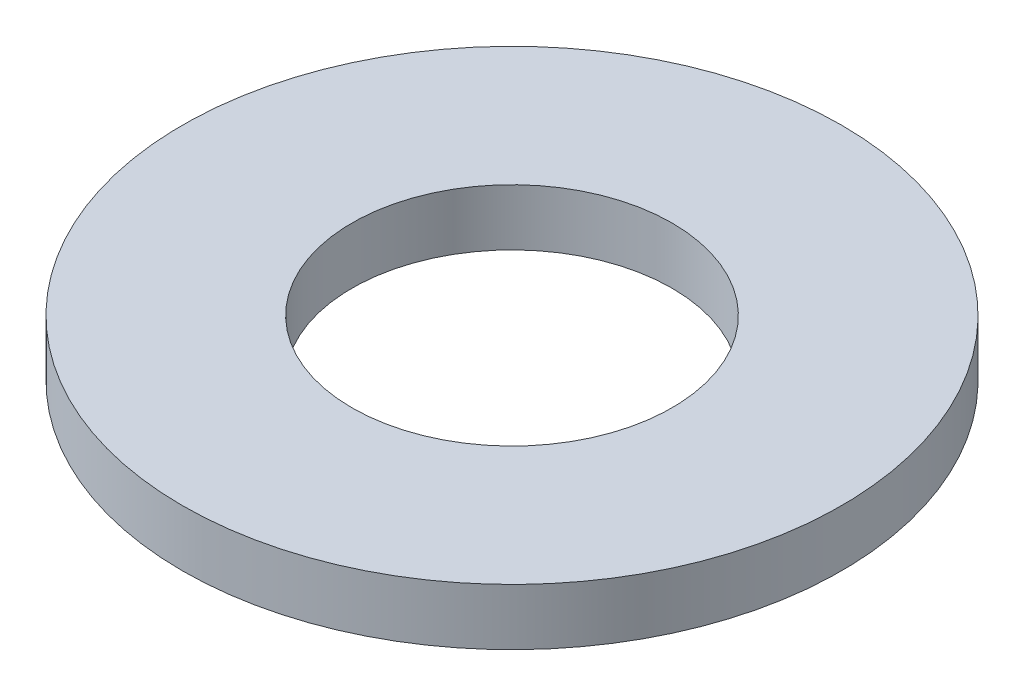
ISO-10303-21;
HEADER;
FILE_DESCRIPTION(('STEP AP214'),'2;1');
FILE_NAME('part.step','',(''),(''),'','','');
FILE_SCHEMA(('AUTOMOTIVE_DESIGN { 1 0 10303 214 1 1 1 1 }'));
ENDSEC;
DATA;
#1=APPLICATION_CONTEXT('core data for automotive mechanical design processes');
#2=APPLICATION_PROTOCOL_DEFINITION('international standard','automotive_design',2000,#1);
#3=PRODUCT_CONTEXT('',#1,'mechanical');
#4=PRODUCT('Part','Part','',(#3));
#5=PRODUCT_RELATED_PRODUCT_CATEGORY('part','',(#4));
#6=PRODUCT_DEFINITION_FORMATION('','',#4);
#7=PRODUCT_DEFINITION_CONTEXT('part definition',#1,'design');
#8=PRODUCT_DEFINITION('design','',#6,#7);
#9=PRODUCT_DEFINITION_SHAPE('','',#8);
#10=(LENGTH_UNIT() NAMED_UNIT(*) SI_UNIT(.MILLI.,.METRE.));
#11=(NAMED_UNIT(*) PLANE_ANGLE_UNIT() SI_UNIT($,.RADIAN.));
#12=(NAMED_UNIT(*) SI_UNIT($,.STERADIAN.) SOLID_ANGLE_UNIT());
#13=UNCERTAINTY_MEASURE_WITH_UNIT(LENGTH_MEASURE(1.E-05),#10,'distance_accuracy_value','');
#14=(GEOMETRIC_REPRESENTATION_CONTEXT(3) GLOBAL_UNCERTAINTY_ASSIGNED_CONTEXT((#13)) GLOBAL_UNIT_ASSIGNED_CONTEXT((#10,
#11,#12)) REPRESENTATION_CONTEXT('',''));
#15=CARTESIAN_POINT('',(0.,0.,0.));
#16=DIRECTION('',(0.,0.,1.));
#17=DIRECTION('',(1.,0.,0.));
#18=AXIS2_PLACEMENT_3D('',#15,#16,#17);
#19=CARTESIAN_POINT('',(0.,1.67737833000221,0.));
#20=DIRECTION('',(0.,1.,0.));
#21=DIRECTION('',(0.,0.,1.));
#22=AXIS2_PLACEMENT_3D('',#19,#20,#21);
#23=CYLINDRICAL_SURFACE('',#22,0.85);
#24=CARTESIAN_POINT('',(0.,0.,0.));
#25=DIRECTION('',(0.,1.,0.));
#26=DIRECTION('',(0.,0.,1.));
#27=AXIS2_PLACEMENT_3D('',#24,#25,#26);
#28=CIRCLE('',#27,0.85);
#29=CARTESIAN_POINT('',(0.,0.,0.85));
#30=VERTEX_POINT('',#29);
#31=EDGE_CURVE('E10',#30,#30,#28,.T.);
#32=ORIENTED_EDGE('',*,*,#31,.F.);
#33=EDGE_LOOP('',(#32));
#34=FACE_BOUND('',#33,.T.);
#35=CARTESIAN_POINT('',(0.,0.3,0.));
#36=DIRECTION('',(0.,1.,0.));
#37=DIRECTION('',(0.,0.,1.));
#38=AXIS2_PLACEMENT_3D('',#35,#36,#37);
#39=CIRCLE('',#38,0.85);
#40=CARTESIAN_POINT('',(0.,0.3,0.85));
#41=VERTEX_POINT('',#40);
#42=EDGE_CURVE('E45',#41,#41,#39,.T.);
#43=ORIENTED_EDGE('',*,*,#42,.T.);
#44=EDGE_LOOP('',(#43));
#45=FACE_BOUND('',#44,.T.);
#46=ADVANCED_FACE('F31',(#34,#45),#23,.F.);
#47=CARTESIAN_POINT('',(0.85,0.,0.));
#48=DIRECTION('',(0.,1.,0.));
#49=DIRECTION('',(0.,0.,1.));
#50=AXIS2_PLACEMENT_3D('',#47,#48,#49);
#51=PLANE('',#50);
#52=CARTESIAN_POINT('',(0.,0.,0.));
#53=DIRECTION('',(0.,1.,0.));
#54=DIRECTION('',(0.,0.,1.));
#55=AXIS2_PLACEMENT_3D('',#52,#53,#54);
#56=CIRCLE('',#55,1.75);
#57=CARTESIAN_POINT('',(0.,0.,1.75));
#58=VERTEX_POINT('',#57);
#59=EDGE_CURVE('E37',#58,#58,#56,.T.);
#60=ORIENTED_EDGE('',*,*,#59,.F.);
#61=EDGE_LOOP('',(#60));
#62=FACE_BOUND('',#61,.T.);
#63=ORIENTED_EDGE('',*,*,#31,.T.);
#64=EDGE_LOOP('',(#63));
#65=FACE_BOUND('',#64,.T.);
#66=ADVANCED_FACE('F60',(#62,#65),#51,.F.);
#67=CARTESIAN_POINT('',(0.,1.67737833000221,0.));
#68=DIRECTION('',(0.,1.,0.));
#69=DIRECTION('',(0.,0.,1.));
#70=AXIS2_PLACEMENT_3D('',#67,#68,#69);
#71=CYLINDRICAL_SURFACE('',#70,1.75);
#72=CARTESIAN_POINT('',(0.,0.3,0.));
#73=DIRECTION('',(0.,1.,0.));
#74=DIRECTION('',(0.,0.,1.));
#75=AXIS2_PLACEMENT_3D('',#72,#73,#74);
#76=CIRCLE('',#75,1.75);
#77=CARTESIAN_POINT('',(0.,0.3,1.75));
#78=VERTEX_POINT('',#77);
#79=EDGE_CURVE('E41',#78,#78,#76,.T.);
#80=ORIENTED_EDGE('',*,*,#79,.F.);
#81=EDGE_LOOP('',(#80));
#82=FACE_BOUND('',#81,.T.);
#83=ORIENTED_EDGE('',*,*,#59,.T.);
#84=EDGE_LOOP('',(#83));
#85=FACE_BOUND('',#84,.T.);
#86=ADVANCED_FACE('F55',(#82,#85),#71,.T.);
#87=CARTESIAN_POINT('',(0.85,0.3,0.));
#88=DIRECTION('',(0.,-1.,0.));
#89=DIRECTION('',(0.,0.,-1.));
#90=AXIS2_PLACEMENT_3D('',#87,#88,#89);
#91=PLANE('',#90);
#92=ORIENTED_EDGE('',*,*,#42,.F.);
#93=EDGE_LOOP('',(#92));
#94=FACE_BOUND('',#93,.T.);
#95=ORIENTED_EDGE('',*,*,#79,.T.);
#96=EDGE_LOOP('',(#95));
#97=FACE_BOUND('',#96,.T.);
#98=ADVANCED_FACE('F52',(#94,#97),#91,.F.);
#99=CLOSED_SHELL('',(#46,#66,#86,#98));
#100=MANIFOLD_SOLID_BREP('B2',#99);
#101=ADVANCED_BREP_SHAPE_REPRESENTATION('',(#18,#100),#14);
#102=SHAPE_DEFINITION_REPRESENTATION(#9,#101);
ENDSEC;
END-ISO-10303-21;
